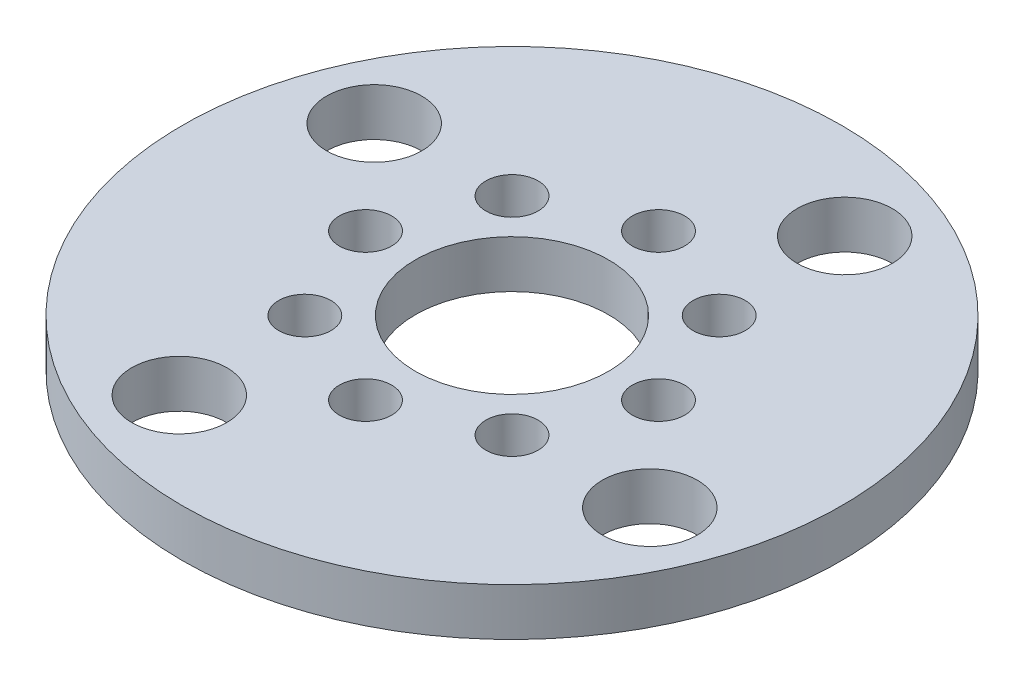
ISO-10303-21;
HEADER;
FILE_DESCRIPTION(('STEP AP214'),'2;1');
FILE_NAME('part.step','',(''),(''),'','','');
FILE_SCHEMA(('AUTOMOTIVE_DESIGN { 1 0 10303 214 1 1 1 1 }'));
ENDSEC;
DATA;
#1=APPLICATION_CONTEXT('core data for automotive mechanical design processes');
#2=APPLICATION_PROTOCOL_DEFINITION('international standard','automotive_design',2000,#1);
#3=PRODUCT_CONTEXT('',#1,'mechanical');
#4=PRODUCT('Part','Part','',(#3));
#5=PRODUCT_RELATED_PRODUCT_CATEGORY('part','',(#4));
#6=PRODUCT_DEFINITION_FORMATION('','',#4);
#7=PRODUCT_DEFINITION_CONTEXT('part definition',#1,'design');
#8=PRODUCT_DEFINITION('design','',#6,#7);
#9=PRODUCT_DEFINITION_SHAPE('','',#8);
#10=(LENGTH_UNIT() NAMED_UNIT(*) SI_UNIT(.MILLI.,.METRE.));
#11=(NAMED_UNIT(*) PLANE_ANGLE_UNIT() SI_UNIT($,.RADIAN.));
#12=(NAMED_UNIT(*) SI_UNIT($,.STERADIAN.) SOLID_ANGLE_UNIT());
#13=UNCERTAINTY_MEASURE_WITH_UNIT(LENGTH_MEASURE(1.E-05),#10,'distance_accuracy_value','');
#14=(GEOMETRIC_REPRESENTATION_CONTEXT(3) GLOBAL_UNCERTAINTY_ASSIGNED_CONTEXT((#13)) GLOBAL_UNIT_ASSIGNED_CONTEXT((#10,
#11,#12)) REPRESENTATION_CONTEXT('',''));
#15=CARTESIAN_POINT('',(0.,0.,0.));
#16=DIRECTION('',(0.,0.,1.));
#17=DIRECTION('',(1.,0.,0.));
#18=AXIS2_PLACEMENT_3D('',#15,#16,#17);
#19=CARTESIAN_POINT('',(0.,-3.175,0.));
#20=DIRECTION('',(0.,1.,0.));
#21=DIRECTION('',(0.,0.,1.));
#22=AXIS2_PLACEMENT_3D('',#19,#20,#21);
#23=CYLINDRICAL_SURFACE('',#22,22.);
#24=CARTESIAN_POINT('',(0.,-3.175,0.));
#25=DIRECTION('',(0.,1.,0.));
#26=DIRECTION('',(0.,0.,1.));
#27=AXIS2_PLACEMENT_3D('',#24,#25,#26);
#28=CIRCLE('',#27,22.);
#29=CARTESIAN_POINT('',(0.,-3.175,22.));
#30=VERTEX_POINT('',#29);
#31=EDGE_CURVE('E10',#30,#30,#28,.T.);
#32=ORIENTED_EDGE('',*,*,#31,.T.);
#33=EDGE_LOOP('',(#32));
#34=FACE_BOUND('',#33,.T.);
#35=CARTESIAN_POINT('',(0.,0.,0.));
#36=DIRECTION('',(0.,1.,0.));
#37=DIRECTION('',(0.,0.,1.));
#38=AXIS2_PLACEMENT_3D('',#35,#36,#37);
#39=CIRCLE('',#38,22.);
#40=CARTESIAN_POINT('',(0.,0.,22.));
#41=VERTEX_POINT('',#40);
#42=EDGE_CURVE('E37',#41,#41,#39,.T.);
#43=ORIENTED_EDGE('',*,*,#42,.F.);
#44=EDGE_LOOP('',(#43));
#45=FACE_BOUND('',#44,.T.);
#46=ADVANCED_FACE('F30',(#34,#45),#23,.T.);
#47=CARTESIAN_POINT('',(0.,-3.175,0.));
#48=DIRECTION('',(0.,1.,0.));
#49=DIRECTION('',(0.,0.,1.));
#50=AXIS2_PLACEMENT_3D('',#47,#48,#49);
#51=PLANE('',#50);
#52=CARTESIAN_POINT('',(-15.7059520526919,-3.175,-6.50561835020642));
#53=DIRECTION('',(0.,1.,0.));
#54=DIRECTION('',(1.,0.,0.));
#55=AXIS2_PLACEMENT_3D('',#52,#53,#54);
#56=CIRCLE('',#55,3.175);
#57=CARTESIAN_POINT('',(-12.5309520526919,-3.175,-6.50561835020643));
#58=VERTEX_POINT('',#57);
#59=EDGE_CURVE('E104',#58,#58,#56,.T.);
#60=ORIENTED_EDGE('',*,*,#59,.T.);
#61=EDGE_LOOP('',(#60));
#62=FACE_BOUND('',#61,.T.);
#63=CARTESIAN_POINT('',(-6.50561835020648,-3.175,15.7059520526919));
#64=DIRECTION('',(0.,1.,0.));
#65=DIRECTION('',(0.,0.,-1.));
#66=AXIS2_PLACEMENT_3D('',#63,#64,#65);
#67=CIRCLE('',#66,3.175);
#68=CARTESIAN_POINT('',(-6.50561835020648,-3.175,12.5309520526919));
#69=VERTEX_POINT('',#68);
#70=EDGE_CURVE('E116',#69,#69,#67,.T.);
#71=ORIENTED_EDGE('',*,*,#70,.T.);
#72=EDGE_LOOP('',(#71));
#73=FACE_BOUND('',#72,.T.);
#74=CARTESIAN_POINT('',(15.705952052692,-3.175,6.50561835020631));
#75=DIRECTION('',(0.,1.,0.));
#76=DIRECTION('',(-1.,0.,0.));
#77=AXIS2_PLACEMENT_3D('',#74,#75,#76);
#78=CIRCLE('',#77,3.175);
#79=CARTESIAN_POINT('',(12.530952052692,-3.175,6.50561835020634));
#80=VERTEX_POINT('',#79);
#81=EDGE_CURVE('E110',#80,#80,#78,.T.);
#82=ORIENTED_EDGE('',*,*,#81,.T.);
#83=EDGE_LOOP('',(#82));
#84=FACE_BOUND('',#83,.T.);
#85=CARTESIAN_POINT('',(6.50561835020648,-3.175,-15.7059520526919));
#86=DIRECTION('',(0.,1.,0.));
#87=DIRECTION('',(0.,0.,1.));
#88=AXIS2_PLACEMENT_3D('',#85,#86,#87);
#89=CIRCLE('',#88,3.175);
#90=CARTESIAN_POINT('',(6.50561835020648,-3.175,-12.5309520526919));
#91=VERTEX_POINT('',#90);
#92=EDGE_CURVE('E98',#91,#91,#89,.T.);
#93=ORIENTED_EDGE('',*,*,#92,.T.);
#94=EDGE_LOOP('',(#93));
#95=FACE_BOUND('',#94,.T.);
#96=CARTESIAN_POINT('',(9.779,-3.175,0.));
#97=DIRECTION('',(0.,1.,0.));
#98=DIRECTION('',(1.,0.,0.));
#99=AXIS2_PLACEMENT_3D('',#96,#97,#98);
#100=CIRCLE('',#99,1.745);
#101=CARTESIAN_POINT('',(11.524,-3.175,0.));
#102=VERTEX_POINT('',#101);
#103=EDGE_CURVE('E82',#102,#102,#100,.T.);
#104=ORIENTED_EDGE('',*,*,#103,.T.);
#105=EDGE_LOOP('',(#104));
#106=FACE_BOUND('',#105,.T.);
#107=CARTESIAN_POINT('',(6.91479721322321,-3.175,-6.91479721322328));
#108=DIRECTION('',(0.,1.,0.));
#109=DIRECTION('',(0.707106781186544,0.,-0.707106781186551));
#110=AXIS2_PLACEMENT_3D('',#107,#108,#109);
#111=CIRCLE('',#110,1.745);
#112=CARTESIAN_POINT('',(8.14869854639373,-3.175,-8.14869854639382));
#113=VERTEX_POINT('',#112);
#114=EDGE_CURVE('E90',#113,#113,#111,.T.);
#115=ORIENTED_EDGE('',*,*,#114,.T.);
#116=EDGE_LOOP('',(#115));
#117=FACE_BOUND('',#116,.T.);
#118=CARTESIAN_POINT('',(0.,-3.175,-9.779));
#119=DIRECTION('',(0.,1.,0.));
#120=DIRECTION('',(0.,0.,-1.));
#121=AXIS2_PLACEMENT_3D('',#118,#119,#120);
#122=CIRCLE('',#121,1.745);
#123=CARTESIAN_POINT('',(0.,-3.175,-11.524));
#124=VERTEX_POINT('',#123);
#125=EDGE_CURVE('E86',#124,#124,#122,.T.);
#126=ORIENTED_EDGE('',*,*,#125,.T.);
#127=EDGE_LOOP('',(#126));
#128=FACE_BOUND('',#127,.T.);
#129=CARTESIAN_POINT('',(-6.91479721322331,-3.175,-6.91479721322319));
#130=DIRECTION('',(0.,1.,0.));
#131=DIRECTION('',(-0.707106781186554,0.,-0.707106781186541));
#132=AXIS2_PLACEMENT_3D('',#129,#130,#131);
#133=CIRCLE('',#132,1.745);
#134=CARTESIAN_POINT('',(-8.14869854639385,-3.175,-8.1486985463937));
#135=VERTEX_POINT('',#134);
#136=EDGE_CURVE('E83',#135,#135,#133,.T.);
#137=ORIENTED_EDGE('',*,*,#136,.T.);
#138=EDGE_LOOP('',(#137));
#139=FACE_BOUND('',#138,.T.);
#140=CARTESIAN_POINT('',(-9.779,-3.175,1.02429588037641E-13));
#141=DIRECTION('',(0.,1.,0.));
#142=DIRECTION('',(-1.,0.,0.));
#143=AXIS2_PLACEMENT_3D('',#140,#141,#142);
#144=CIRCLE('',#143,1.745);
#145=CARTESIAN_POINT('',(-11.524,-3.175,1.20707492846485E-13));
#146=VERTEX_POINT('',#145);
#147=EDGE_CURVE('E87',#146,#146,#144,.T.);
#148=ORIENTED_EDGE('',*,*,#147,.T.);
#149=EDGE_LOOP('',(#148));
#150=FACE_BOUND('',#149,.T.);
#151=CARTESIAN_POINT('',(-6.91479721322316,-3.175,6.91479721322333));
#152=DIRECTION('',(0.,1.,0.));
#153=DIRECTION('',(-0.707106781186539,0.,0.707106781186556));
#154=AXIS2_PLACEMENT_3D('',#151,#152,#153);
#155=CIRCLE('',#154,1.745);
#156=CARTESIAN_POINT('',(-8.14869854639367,-3.175,8.14869854639387));
#157=VERTEX_POINT('',#156);
#158=EDGE_CURVE('E95',#157,#157,#155,.T.);
#159=ORIENTED_EDGE('',*,*,#158,.T.);
#160=EDGE_LOOP('',(#159));
#161=FACE_BOUND('',#160,.T.);
#162=CARTESIAN_POINT('',(6.91479721322326,-3.175,6.91479721322324));
#163=DIRECTION('',(0.,1.,0.));
#164=DIRECTION('',(0.707106781186549,0.,0.707106781186546));
#165=AXIS2_PLACEMENT_3D('',#162,#163,#164);
#166=CIRCLE('',#165,1.745);
#167=CARTESIAN_POINT('',(8.14869854639379,-3.175,8.14869854639376));
#168=VERTEX_POINT('',#167);
#169=EDGE_CURVE('E54',#168,#168,#166,.T.);
#170=ORIENTED_EDGE('',*,*,#169,.T.);
#171=EDGE_LOOP('',(#170));
#172=FACE_BOUND('',#171,.T.);
#173=CARTESIAN_POINT('',(0.,-3.175,0.));
#174=DIRECTION('',(0.,1.,0.));
#175=DIRECTION('',(0.,0.,1.));
#176=AXIS2_PLACEMENT_3D('',#173,#174,#175);
#177=CIRCLE('',#176,6.45);
#178=CARTESIAN_POINT('',(0.,-3.175,6.45));
#179=VERTEX_POINT('',#178);
#180=EDGE_CURVE('E74',#179,#179,#177,.T.);
#181=ORIENTED_EDGE('',*,*,#180,.T.);
#182=EDGE_LOOP('',(#181));
#183=FACE_BOUND('',#182,.T.);
#184=CARTESIAN_POINT('',(0.,-3.175,9.779));
#185=DIRECTION('',(0.,1.,0.));
#186=DIRECTION('',(0.,0.,1.));
#187=AXIS2_PLACEMENT_3D('',#184,#185,#186);
#188=CIRCLE('',#187,1.745);
#189=CARTESIAN_POINT('',(0.,-3.175,11.524));
#190=VERTEX_POINT('',#189);
#191=EDGE_CURVE('E45',#190,#190,#188,.T.);
#192=ORIENTED_EDGE('',*,*,#191,.T.);
#193=EDGE_LOOP('',(#192));
#194=FACE_BOUND('',#193,.T.);
#195=ORIENTED_EDGE('',*,*,#31,.F.);
#196=EDGE_LOOP('',(#195));
#197=FACE_BOUND('',#196,.T.);
#198=ADVANCED_FACE('F125',(#62,#73,#84,#95,#106,#117,#128,#139,#150,#161,#172,#183,#194,#197),
#51,.F.);
#199=CARTESIAN_POINT('',(0.,0.,0.));
#200=DIRECTION('',(0.,1.,0.));
#201=DIRECTION('',(0.,0.,1.));
#202=AXIS2_PLACEMENT_3D('',#199,#200,#201);
#203=PLANE('',#202);
#204=CARTESIAN_POINT('',(-15.7059520526919,0.,-6.50561835020642));
#205=DIRECTION('',(0.,1.,0.));
#206=DIRECTION('',(1.,0.,0.));
#207=AXIS2_PLACEMENT_3D('',#204,#205,#206);
#208=CIRCLE('',#207,3.175);
#209=CARTESIAN_POINT('',(-12.5309520526919,0.,-6.50561835020643));
#210=VERTEX_POINT('',#209);
#211=EDGE_CURVE('E119',#210,#210,#208,.T.);
#212=ORIENTED_EDGE('',*,*,#211,.F.);
#213=EDGE_LOOP('',(#212));
#214=FACE_BOUND('',#213,.T.);
#215=CARTESIAN_POINT('',(-6.50561835020648,0.,15.7059520526919));
#216=DIRECTION('',(0.,1.,0.));
#217=DIRECTION('',(0.,0.,-1.));
#218=AXIS2_PLACEMENT_3D('',#215,#216,#217);
#219=CIRCLE('',#218,3.175);
#220=CARTESIAN_POINT('',(-6.50561835020648,0.,12.5309520526919));
#221=VERTEX_POINT('',#220);
#222=EDGE_CURVE('E113',#221,#221,#219,.T.);
#223=ORIENTED_EDGE('',*,*,#222,.F.);
#224=EDGE_LOOP('',(#223));
#225=FACE_BOUND('',#224,.T.);
#226=CARTESIAN_POINT('',(15.705952052692,0.,6.50561835020631));
#227=DIRECTION('',(0.,1.,0.));
#228=DIRECTION('',(-1.,0.,0.));
#229=AXIS2_PLACEMENT_3D('',#226,#227,#228);
#230=CIRCLE('',#229,3.175);
#231=CARTESIAN_POINT('',(12.530952052692,0.,6.50561835020634));
#232=VERTEX_POINT('',#231);
#233=EDGE_CURVE('E107',#232,#232,#230,.T.);
#234=ORIENTED_EDGE('',*,*,#233,.F.);
#235=EDGE_LOOP('',(#234));
#236=FACE_BOUND('',#235,.T.);
#237=CARTESIAN_POINT('',(6.50561835020648,0.,-15.7059520526919));
#238=DIRECTION('',(0.,1.,0.));
#239=DIRECTION('',(0.,0.,1.));
#240=AXIS2_PLACEMENT_3D('',#237,#238,#239);
#241=CIRCLE('',#240,3.175);
#242=CARTESIAN_POINT('',(6.50561835020648,0.,-12.5309520526919));
#243=VERTEX_POINT('',#242);
#244=EDGE_CURVE('E101',#243,#243,#241,.T.);
#245=ORIENTED_EDGE('',*,*,#244,.F.);
#246=EDGE_LOOP('',(#245));
#247=FACE_BOUND('',#246,.T.);
#248=CARTESIAN_POINT('',(9.779,0.,0.));
#249=DIRECTION('',(0.,1.,0.));
#250=DIRECTION('',(0.,0.,1.));
#251=AXIS2_PLACEMENT_3D('',#248,#249,#250);
#252=CIRCLE('',#251,1.745);
#253=CARTESIAN_POINT('',(9.779,0.,1.74499999999997));
#254=VERTEX_POINT('',#253);
#255=EDGE_CURVE('E33',#254,#254,#252,.T.);
#256=ORIENTED_EDGE('',*,*,#255,.F.);
#257=EDGE_LOOP('',(#256));
#258=FACE_BOUND('',#257,.T.);
#259=CARTESIAN_POINT('',(6.91479721322321,0.,-6.91479721322328));
#260=DIRECTION('',(0.,1.,0.));
#261=DIRECTION('',(0.,0.,1.));
#262=AXIS2_PLACEMENT_3D('',#259,#260,#261);
#263=CIRCLE('',#262,1.745);
#264=CARTESIAN_POINT('',(6.91479721322321,0.,-5.16979721322328));
#265=VERTEX_POINT('',#264);
#266=EDGE_CURVE('E65',#265,#265,#263,.T.);
#267=ORIENTED_EDGE('',*,*,#266,.F.);
#268=EDGE_LOOP('',(#267));
#269=FACE_BOUND('',#268,.T.);
#270=CARTESIAN_POINT('',(0.,0.,-9.779));
#271=DIRECTION('',(0.,1.,0.));
#272=DIRECTION('',(0.,0.,1.));
#273=AXIS2_PLACEMENT_3D('',#270,#271,#272);
#274=CIRCLE('',#273,1.745);
#275=CARTESIAN_POINT('',(0.,0.,-8.034));
#276=VERTEX_POINT('',#275);
#277=EDGE_CURVE('E63',#276,#276,#274,.T.);
#278=ORIENTED_EDGE('',*,*,#277,.F.);
#279=EDGE_LOOP('',(#278));
#280=FACE_BOUND('',#279,.T.);
#281=CARTESIAN_POINT('',(-6.91479721322331,0.,-6.91479721322319));
#282=DIRECTION('',(0.,1.,0.));
#283=DIRECTION('',(0.,0.,1.));
#284=AXIS2_PLACEMENT_3D('',#281,#282,#283);
#285=CIRCLE('',#284,1.745);
#286=CARTESIAN_POINT('',(-6.91479721322331,0.,-5.16979721322319));
#287=VERTEX_POINT('',#286);
#288=EDGE_CURVE('E60',#287,#287,#285,.T.);
#289=ORIENTED_EDGE('',*,*,#288,.F.);
#290=EDGE_LOOP('',(#289));
#291=FACE_BOUND('',#290,.T.);
#292=CARTESIAN_POINT('',(-9.779,0.,1.02429588037641E-13));
#293=DIRECTION('',(0.,1.,0.));
#294=DIRECTION('',(0.,0.,1.));
#295=AXIS2_PLACEMENT_3D('',#292,#293,#294);
#296=CIRCLE('',#295,1.745);
#297=CARTESIAN_POINT('',(-9.779,0.,1.7450000000001));
#298=VERTEX_POINT('',#297);
#299=EDGE_CURVE('E57',#298,#298,#296,.T.);
#300=ORIENTED_EDGE('',*,*,#299,.F.);
#301=EDGE_LOOP('',(#300));
#302=FACE_BOUND('',#301,.T.);
#303=CARTESIAN_POINT('',(-6.91479721322316,0.,6.91479721322333));
#304=DIRECTION('',(0.,1.,0.));
#305=DIRECTION('',(0.,0.,1.));
#306=AXIS2_PLACEMENT_3D('',#303,#304,#305);
#307=CIRCLE('',#306,1.745);
#308=CARTESIAN_POINT('',(-6.91479721322316,0.,8.65979721322333));
#309=VERTEX_POINT('',#308);
#310=EDGE_CURVE('E53',#309,#309,#307,.T.);
#311=ORIENTED_EDGE('',*,*,#310,.F.);
#312=EDGE_LOOP('',(#311));
#313=FACE_BOUND('',#312,.T.);
#314=CARTESIAN_POINT('',(6.91479721322326,0.,6.91479721322324));
#315=DIRECTION('',(0.,1.,0.));
#316=DIRECTION('',(0.,0.,1.));
#317=AXIS2_PLACEMENT_3D('',#314,#315,#316);
#318=CIRCLE('',#317,1.745);
#319=CARTESIAN_POINT('',(6.91479721322326,0.,8.65979721322324));
#320=VERTEX_POINT('',#319);
#321=EDGE_CURVE('E50',#320,#320,#318,.T.);
#322=ORIENTED_EDGE('',*,*,#321,.F.);
#323=EDGE_LOOP('',(#322));
#324=FACE_BOUND('',#323,.T.);
#325=CARTESIAN_POINT('',(0.,0.,0.));
#326=DIRECTION('',(0.,1.,0.));
#327=DIRECTION('',(0.,0.,1.));
#328=AXIS2_PLACEMENT_3D('',#325,#326,#327);
#329=CIRCLE('',#328,6.45);
#330=CARTESIAN_POINT('',(0.,0.,6.45));
#331=VERTEX_POINT('',#330);
#332=EDGE_CURVE('E70',#331,#331,#329,.T.);
#333=ORIENTED_EDGE('',*,*,#332,.F.);
#334=EDGE_LOOP('',(#333));
#335=FACE_BOUND('',#334,.T.);
#336=CARTESIAN_POINT('',(0.,0.,9.779));
#337=DIRECTION('',(0.,1.,0.));
#338=DIRECTION('',(0.,0.,1.));
#339=AXIS2_PLACEMENT_3D('',#336,#337,#338);
#340=CIRCLE('',#339,1.745);
#341=CARTESIAN_POINT('',(0.,0.,11.524));
#342=VERTEX_POINT('',#341);
#343=EDGE_CURVE('E42',#342,#342,#340,.T.);
#344=ORIENTED_EDGE('',*,*,#343,.F.);
#345=EDGE_LOOP('',(#344));
#346=FACE_BOUND('',#345,.T.);
#347=ORIENTED_EDGE('',*,*,#42,.T.);
#348=EDGE_LOOP('',(#347));
#349=FACE_BOUND('',#348,.T.);
#350=ADVANCED_FACE('F135',(#214,#225,#236,#247,#258,#269,#280,#291,#302,#313,#324,#335,#346,
#349),#203,.T.);
#351=CARTESIAN_POINT('',(0.,-3.175,9.779));
#352=DIRECTION('',(0.,1.,0.));
#353=DIRECTION('',(0.,0.,1.));
#354=AXIS2_PLACEMENT_3D('',#351,#352,#353);
#355=CYLINDRICAL_SURFACE('',#354,1.745);
#356=ORIENTED_EDGE('',*,*,#343,.T.);
#357=EDGE_LOOP('',(#356));
#358=FACE_BOUND('',#357,.T.);
#359=ORIENTED_EDGE('',*,*,#191,.F.);
#360=EDGE_LOOP('',(#359));
#361=FACE_BOUND('',#360,.T.);
#362=ADVANCED_FACE('F138',(#358,#361),#355,.F.);
#363=CARTESIAN_POINT('',(0.,-3.175,0.));
#364=DIRECTION('',(0.,1.,0.));
#365=DIRECTION('',(0.,0.,1.));
#366=AXIS2_PLACEMENT_3D('',#363,#364,#365);
#367=CYLINDRICAL_SURFACE('',#366,6.45);
#368=ORIENTED_EDGE('',*,*,#180,.F.);
#369=EDGE_LOOP('',(#368));
#370=FACE_BOUND('',#369,.T.);
#371=ORIENTED_EDGE('',*,*,#332,.T.);
#372=EDGE_LOOP('',(#371));
#373=FACE_BOUND('',#372,.T.);
#374=ADVANCED_FACE('F172',(#370,#373),#367,.F.);
#375=CARTESIAN_POINT('',(6.91479721322326,-3.175,6.91479721322324));
#376=DIRECTION('',(0.,1.,0.));
#377=DIRECTION('',(0.,0.,1.));
#378=AXIS2_PLACEMENT_3D('',#375,#376,#377);
#379=CYLINDRICAL_SURFACE('',#378,1.745);
#380=ORIENTED_EDGE('',*,*,#321,.T.);
#381=EDGE_LOOP('',(#380));
#382=FACE_BOUND('',#381,.T.);
#383=ORIENTED_EDGE('',*,*,#169,.F.);
#384=EDGE_LOOP('',(#383));
#385=FACE_BOUND('',#384,.T.);
#386=ADVANCED_FACE('F176',(#382,#385),#379,.F.);
#387=CARTESIAN_POINT('',(-6.91479721322316,-3.175,6.91479721322333));
#388=DIRECTION('',(0.,1.,0.));
#389=DIRECTION('',(0.,0.,1.));
#390=AXIS2_PLACEMENT_3D('',#387,#388,#389);
#391=CYLINDRICAL_SURFACE('',#390,1.745);
#392=ORIENTED_EDGE('',*,*,#310,.T.);
#393=EDGE_LOOP('',(#392));
#394=FACE_BOUND('',#393,.T.);
#395=ORIENTED_EDGE('',*,*,#158,.F.);
#396=EDGE_LOOP('',(#395));
#397=FACE_BOUND('',#396,.T.);
#398=ADVANCED_FACE('F180',(#394,#397),#391,.F.);
#399=CARTESIAN_POINT('',(-9.779,-3.175,1.02429588037641E-13));
#400=DIRECTION('',(0.,1.,0.));
#401=DIRECTION('',(0.,0.,1.));
#402=AXIS2_PLACEMENT_3D('',#399,#400,#401);
#403=CYLINDRICAL_SURFACE('',#402,1.745);
#404=ORIENTED_EDGE('',*,*,#299,.T.);
#405=EDGE_LOOP('',(#404));
#406=FACE_BOUND('',#405,.T.);
#407=ORIENTED_EDGE('',*,*,#147,.F.);
#408=EDGE_LOOP('',(#407));
#409=FACE_BOUND('',#408,.T.);
#410=ADVANCED_FACE('F186',(#406,#409),#403,.F.);
#411=CARTESIAN_POINT('',(-6.91479721322331,-3.175,-6.91479721322319));
#412=DIRECTION('',(0.,1.,0.));
#413=DIRECTION('',(0.,0.,1.));
#414=AXIS2_PLACEMENT_3D('',#411,#412,#413);
#415=CYLINDRICAL_SURFACE('',#414,1.745);
#416=ORIENTED_EDGE('',*,*,#288,.T.);
#417=EDGE_LOOP('',(#416));
#418=FACE_BOUND('',#417,.T.);
#419=ORIENTED_EDGE('',*,*,#136,.F.);
#420=EDGE_LOOP('',(#419));
#421=FACE_BOUND('',#420,.T.);
#422=ADVANCED_FACE('F182',(#418,#421),#415,.F.);
#423=CARTESIAN_POINT('',(0.,-3.175,-9.779));
#424=DIRECTION('',(0.,1.,0.));
#425=DIRECTION('',(0.,0.,1.));
#426=AXIS2_PLACEMENT_3D('',#423,#424,#425);
#427=CYLINDRICAL_SURFACE('',#426,1.745);
#428=ORIENTED_EDGE('',*,*,#277,.T.);
#429=EDGE_LOOP('',(#428));
#430=FACE_BOUND('',#429,.T.);
#431=ORIENTED_EDGE('',*,*,#125,.F.);
#432=EDGE_LOOP('',(#431));
#433=FACE_BOUND('',#432,.T.);
#434=ADVANCED_FACE('F185',(#430,#433),#427,.F.);
#435=CARTESIAN_POINT('',(6.91479721322321,-3.175,-6.91479721322328));
#436=DIRECTION('',(0.,1.,0.));
#437=DIRECTION('',(0.,0.,1.));
#438=AXIS2_PLACEMENT_3D('',#435,#436,#437);
#439=CYLINDRICAL_SURFACE('',#438,1.745);
#440=ORIENTED_EDGE('',*,*,#266,.T.);
#441=EDGE_LOOP('',(#440));
#442=FACE_BOUND('',#441,.T.);
#443=ORIENTED_EDGE('',*,*,#114,.F.);
#444=EDGE_LOOP('',(#443));
#445=FACE_BOUND('',#444,.T.);
#446=ADVANCED_FACE('F190',(#442,#445),#439,.F.);
#447=CARTESIAN_POINT('',(9.779,-3.175,0.));
#448=DIRECTION('',(0.,1.,0.));
#449=DIRECTION('',(0.,0.,1.));
#450=AXIS2_PLACEMENT_3D('',#447,#448,#449);
#451=CYLINDRICAL_SURFACE('',#450,1.745);
#452=ORIENTED_EDGE('',*,*,#255,.T.);
#453=EDGE_LOOP('',(#452));
#454=FACE_BOUND('',#453,.T.);
#455=ORIENTED_EDGE('',*,*,#103,.F.);
#456=EDGE_LOOP('',(#455));
#457=FACE_BOUND('',#456,.T.);
#458=ADVANCED_FACE('F194',(#454,#457),#451,.F.);
#459=CARTESIAN_POINT('',(6.50561835020648,-3.175,-15.7059520526919));
#460=DIRECTION('',(0.,1.,0.));
#461=DIRECTION('',(0.,0.,1.));
#462=AXIS2_PLACEMENT_3D('',#459,#460,#461);
#463=CYLINDRICAL_SURFACE('',#462,3.175);
#464=ORIENTED_EDGE('',*,*,#92,.F.);
#465=EDGE_LOOP('',(#464));
#466=FACE_BOUND('',#465,.T.);
#467=ORIENTED_EDGE('',*,*,#244,.T.);
#468=EDGE_LOOP('',(#467));
#469=FACE_BOUND('',#468,.T.);
#470=ADVANCED_FACE('F197',(#466,#469),#463,.F.);
#471=CARTESIAN_POINT('',(15.705952052692,-3.175,6.50561835020631));
#472=DIRECTION('',(0.,1.,0.));
#473=DIRECTION('',(0.,0.,1.));
#474=AXIS2_PLACEMENT_3D('',#471,#472,#473);
#475=CYLINDRICAL_SURFACE('',#474,3.175);
#476=ORIENTED_EDGE('',*,*,#81,.F.);
#477=EDGE_LOOP('',(#476));
#478=FACE_BOUND('',#477,.T.);
#479=ORIENTED_EDGE('',*,*,#233,.T.);
#480=EDGE_LOOP('',(#479));
#481=FACE_BOUND('',#480,.T.);
#482=ADVANCED_FACE('F206',(#478,#481),#475,.F.);
#483=CARTESIAN_POINT('',(-6.50561835020648,-3.175,15.7059520526919));
#484=DIRECTION('',(0.,1.,0.));
#485=DIRECTION('',(0.,0.,1.));
#486=AXIS2_PLACEMENT_3D('',#483,#484,#485);
#487=CYLINDRICAL_SURFACE('',#486,3.175);
#488=ORIENTED_EDGE('',*,*,#70,.F.);
#489=EDGE_LOOP('',(#488));
#490=FACE_BOUND('',#489,.T.);
#491=ORIENTED_EDGE('',*,*,#222,.T.);
#492=EDGE_LOOP('',(#491));
#493=FACE_BOUND('',#492,.T.);
#494=ADVANCED_FACE('F131',(#490,#493),#487,.F.);
#495=CARTESIAN_POINT('',(-15.7059520526919,-3.175,-6.50561835020642));
#496=DIRECTION('',(0.,1.,0.));
#497=DIRECTION('',(0.,0.,1.));
#498=AXIS2_PLACEMENT_3D('',#495,#496,#497);
#499=CYLINDRICAL_SURFACE('',#498,3.175);
#500=ORIENTED_EDGE('',*,*,#59,.F.);
#501=EDGE_LOOP('',(#500));
#502=FACE_BOUND('',#501,.T.);
#503=ORIENTED_EDGE('',*,*,#211,.T.);
#504=EDGE_LOOP('',(#503));
#505=FACE_BOUND('',#504,.T.);
#506=ADVANCED_FACE('F128',(#502,#505),#499,.F.);
#507=CLOSED_SHELL('',(#46,#198,#350,#362,#374,#386,#398,#410,#422,#434,#446,#458,#470,#482,#494,#506));
#508=MANIFOLD_SOLID_BREP('B2',#507);
#509=ADVANCED_BREP_SHAPE_REPRESENTATION('',(#18,#508),#14);
#510=SHAPE_DEFINITION_REPRESENTATION(#9,#509);
ENDSEC;
END-ISO-10303-21;
